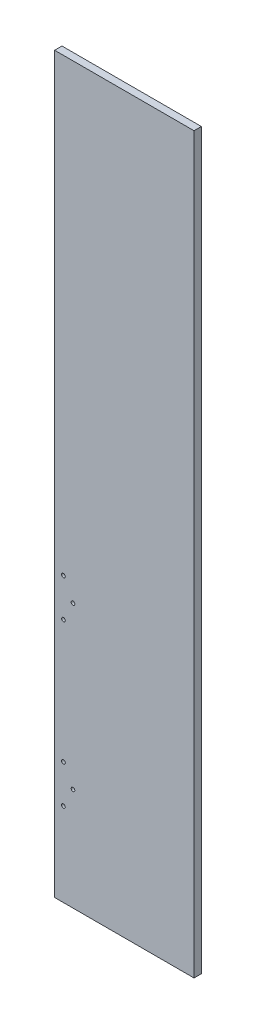
ISO-10303-21;
HEADER;
FILE_DESCRIPTION(('STEP AP214'),'2;1');
FILE_NAME('part.step','',(''),(''),'','','');
FILE_SCHEMA(('AUTOMOTIVE_DESIGN { 1 0 10303 214 1 1 1 1 }'));
ENDSEC;
DATA;
#1=APPLICATION_CONTEXT('core data for automotive mechanical design processes');
#2=APPLICATION_PROTOCOL_DEFINITION('international standard','automotive_design',2000,#1);
#3=PRODUCT_CONTEXT('',#1,'mechanical');
#4=PRODUCT('Part','Part','',(#3));
#5=PRODUCT_RELATED_PRODUCT_CATEGORY('part','',(#4));
#6=PRODUCT_DEFINITION_FORMATION('','',#4);
#7=PRODUCT_DEFINITION_CONTEXT('part definition',#1,'design');
#8=PRODUCT_DEFINITION('design','',#6,#7);
#9=PRODUCT_DEFINITION_SHAPE('','',#8);
#10=(LENGTH_UNIT() NAMED_UNIT(*) SI_UNIT(.MILLI.,.METRE.));
#11=(NAMED_UNIT(*) PLANE_ANGLE_UNIT() SI_UNIT($,.RADIAN.));
#12=(NAMED_UNIT(*) SI_UNIT($,.STERADIAN.) SOLID_ANGLE_UNIT());
#13=UNCERTAINTY_MEASURE_WITH_UNIT(LENGTH_MEASURE(1.E-05),#10,'distance_accuracy_value','');
#14=(GEOMETRIC_REPRESENTATION_CONTEXT(3) GLOBAL_UNCERTAINTY_ASSIGNED_CONTEXT((#13)) GLOBAL_UNIT_ASSIGNED_CONTEXT((#10,
#11,#12)) REPRESENTATION_CONTEXT('',''));
#15=CARTESIAN_POINT('',(0.,0.,0.));
#16=DIRECTION('',(0.,0.,1.));
#17=DIRECTION('',(1.,0.,0.));
#18=AXIS2_PLACEMENT_3D('',#15,#16,#17);
#19=CARTESIAN_POINT('',(-95.,-500.,10.));
#20=DIRECTION('',(1.,0.,0.));
#21=DIRECTION('',(0.,0.,-1.));
#22=AXIS2_PLACEMENT_3D('',#19,#20,#21);
#23=PLANE('',#22);
#24=DIRECTION('',(0.,-1.,0.));
#25=VECTOR('',#24,1.);
#26=CARTESIAN_POINT('',(-95.,-500.,0.));
#27=LINE('',#26,#25);
#28=CARTESIAN_POINT('',(-95.,500.,0.));
#29=VERTEX_POINT('',#28);
#30=CARTESIAN_POINT('',(-95.,-500.,0.));
#31=VERTEX_POINT('',#30);
#32=EDGE_CURVE('E96',#29,#31,#27,.T.);
#33=ORIENTED_EDGE('',*,*,#32,.T.);
#34=DIRECTION('',(0.,0.,-1.));
#35=VECTOR('',#34,1.);
#36=CARTESIAN_POINT('',(-95.,-500.,10.));
#37=LINE('',#36,#35);
#38=CARTESIAN_POINT('',(-95.,-500.,10.));
#39=VERTEX_POINT('',#38);
#40=EDGE_CURVE('E11',#39,#31,#37,.T.);
#41=ORIENTED_EDGE('',*,*,#40,.F.);
#42=DIRECTION('',(0.,-1.,0.));
#43=VECTOR('',#42,1.);
#44=CARTESIAN_POINT('',(-95.,-500.,10.));
#45=LINE('',#44,#43);
#46=CARTESIAN_POINT('',(-95.,500.,10.));
#47=VERTEX_POINT('',#46);
#48=EDGE_CURVE('E84',#47,#39,#45,.T.);
#49=ORIENTED_EDGE('',*,*,#48,.F.);
#50=DIRECTION('',(0.,0.,-1.));
#51=VECTOR('',#50,1.);
#52=CARTESIAN_POINT('',(-95.,500.,10.));
#53=LINE('',#52,#51);
#54=EDGE_CURVE('E92',#47,#29,#53,.T.);
#55=ORIENTED_EDGE('',*,*,#54,.T.);
#56=EDGE_LOOP('',(#33,#41,#49,#55));
#57=FACE_BOUND('',#56,.T.);
#58=ADVANCED_FACE('F33',(#57),#23,.F.);
#59=CARTESIAN_POINT('',(95.,-500.,10.));
#60=DIRECTION('',(0.,1.,0.));
#61=DIRECTION('',(0.,0.,1.));
#62=AXIS2_PLACEMENT_3D('',#59,#60,#61);
#63=PLANE('',#62);
#64=DIRECTION('',(1.,0.,0.));
#65=VECTOR('',#64,1.);
#66=CARTESIAN_POINT('',(95.,-500.,0.));
#67=LINE('',#66,#65);
#68=CARTESIAN_POINT('',(95.,-500.,0.));
#69=VERTEX_POINT('',#68);
#70=EDGE_CURVE('E88',#31,#69,#67,.T.);
#71=ORIENTED_EDGE('',*,*,#70,.T.);
#72=DIRECTION('',(0.,0.,-1.));
#73=VECTOR('',#72,1.);
#74=CARTESIAN_POINT('',(95.,-500.,10.));
#75=LINE('',#74,#73);
#76=CARTESIAN_POINT('',(95.,-500.,10.));
#77=VERTEX_POINT('',#76);
#78=EDGE_CURVE('E41',#77,#69,#75,.T.);
#79=ORIENTED_EDGE('',*,*,#78,.F.);
#80=DIRECTION('',(1.,0.,0.));
#81=VECTOR('',#80,1.);
#82=CARTESIAN_POINT('',(95.,-500.,10.));
#83=LINE('',#82,#81);
#84=EDGE_CURVE('E79',#39,#77,#83,.T.);
#85=ORIENTED_EDGE('',*,*,#84,.F.);
#86=ORIENTED_EDGE('',*,*,#40,.T.);
#87=EDGE_LOOP('',(#71,#79,#85,#86));
#88=FACE_BOUND('',#87,.T.);
#89=ADVANCED_FACE('F87',(#88),#63,.F.);
#90=CARTESIAN_POINT('',(95.,-500.,10.));
#91=DIRECTION('',(-1.,0.,0.));
#92=DIRECTION('',(0.,0.,1.));
#93=AXIS2_PLACEMENT_3D('',#90,#91,#92);
#94=PLANE('',#93);
#95=DIRECTION('',(0.,1.,0.));
#96=VECTOR('',#95,1.);
#97=CARTESIAN_POINT('',(95.,-500.,0.));
#98=LINE('',#97,#96);
#99=CARTESIAN_POINT('',(95.,500.,0.));
#100=VERTEX_POINT('',#99);
#101=EDGE_CURVE('E66',#69,#100,#98,.T.);
#102=ORIENTED_EDGE('',*,*,#101,.T.);
#103=DIRECTION('',(0.,0.,-1.));
#104=VECTOR('',#103,1.);
#105=CARTESIAN_POINT('',(95.,500.,10.));
#106=LINE('',#105,#104);
#107=CARTESIAN_POINT('',(95.,500.,10.));
#108=VERTEX_POINT('',#107);
#109=EDGE_CURVE('E89',#108,#100,#106,.T.);
#110=ORIENTED_EDGE('',*,*,#109,.F.);
#111=DIRECTION('',(0.,1.,0.));
#112=VECTOR('',#111,1.);
#113=CARTESIAN_POINT('',(95.,-500.,10.));
#114=LINE('',#113,#112);
#115=EDGE_CURVE('E82',#77,#108,#114,.T.);
#116=ORIENTED_EDGE('',*,*,#115,.F.);
#117=ORIENTED_EDGE('',*,*,#78,.T.);
#118=EDGE_LOOP('',(#102,#110,#116,#117));
#119=FACE_BOUND('',#118,.T.);
#120=ADVANCED_FACE('F90',(#119),#94,.F.);
#121=CARTESIAN_POINT('',(95.,500.,10.));
#122=DIRECTION('',(0.,-1.,0.));
#123=DIRECTION('',(0.,0.,-1.));
#124=AXIS2_PLACEMENT_3D('',#121,#122,#123);
#125=PLANE('',#124);
#126=DIRECTION('',(-1.,0.,0.));
#127=VECTOR('',#126,1.);
#128=CARTESIAN_POINT('',(95.,500.,0.));
#129=LINE('',#128,#127);
#130=EDGE_CURVE('E72',#100,#29,#129,.T.);
#131=ORIENTED_EDGE('',*,*,#130,.T.);
#132=ORIENTED_EDGE('',*,*,#54,.F.);
#133=DIRECTION('',(-1.,0.,0.));
#134=VECTOR('',#133,1.);
#135=CARTESIAN_POINT('',(95.,500.,10.));
#136=LINE('',#135,#134);
#137=EDGE_CURVE('E49',#108,#47,#136,.T.);
#138=ORIENTED_EDGE('',*,*,#137,.F.);
#139=ORIENTED_EDGE('',*,*,#109,.T.);
#140=EDGE_LOOP('',(#131,#132,#138,#139));
#141=FACE_BOUND('',#140,.T.);
#142=ADVANCED_FACE('F104',(#141),#125,.F.);
#143=CARTESIAN_POINT('',(0.,0.,10.));
#144=DIRECTION('',(0.,0.,1.));
#145=DIRECTION('',(1.,0.,0.));
#146=AXIS2_PLACEMENT_3D('',#143,#144,#145);
#147=PLANE('',#146);
#148=CARTESIAN_POINT('',(-70.,-360.,10.));
#149=DIRECTION('',(0.,0.,1.));
#150=DIRECTION('',(1.,0.,0.));
#151=AXIS2_PLACEMENT_3D('',#148,#149,#150);
#152=CIRCLE('',#151,2.5);
#153=CARTESIAN_POINT('',(-67.5,-360.,10.));
#154=VERTEX_POINT('',#153);
#155=EDGE_CURVE('E140',#154,#154,#152,.T.);
#156=ORIENTED_EDGE('',*,*,#155,.F.);
#157=EDGE_LOOP('',(#156));
#158=FACE_BOUND('',#157,.T.);
#159=CARTESIAN_POINT('',(-83.,-334.,10.));
#160=DIRECTION('',(0.,0.,1.));
#161=DIRECTION('',(1.,0.,0.));
#162=AXIS2_PLACEMENT_3D('',#159,#160,#161);
#163=CIRCLE('',#162,2.50000000000001);
#164=CARTESIAN_POINT('',(-80.5,-334.,10.));
#165=VERTEX_POINT('',#164);
#166=EDGE_CURVE('E134',#165,#165,#163,.T.);
#167=ORIENTED_EDGE('',*,*,#166,.F.);
#168=EDGE_LOOP('',(#167));
#169=FACE_BOUND('',#168,.T.);
#170=CARTESIAN_POINT('',(-83.,-166.,10.));
#171=DIRECTION('',(0.,0.,1.));
#172=DIRECTION('',(1.,0.,0.));
#173=AXIS2_PLACEMENT_3D('',#170,#171,#172);
#174=CIRCLE('',#173,2.50000000000001);
#175=CARTESIAN_POINT('',(-80.5,-166.,10.));
#176=VERTEX_POINT('',#175);
#177=EDGE_CURVE('E128',#176,#176,#174,.T.);
#178=ORIENTED_EDGE('',*,*,#177,.F.);
#179=EDGE_LOOP('',(#178));
#180=FACE_BOUND('',#179,.T.);
#181=CARTESIAN_POINT('',(-70.,-140.,10.));
#182=DIRECTION('',(0.,0.,1.));
#183=DIRECTION('',(1.,0.,0.));
#184=AXIS2_PLACEMENT_3D('',#181,#182,#183);
#185=CIRCLE('',#184,2.5);
#186=CARTESIAN_POINT('',(-67.5,-140.,10.));
#187=VERTEX_POINT('',#186);
#188=EDGE_CURVE('E122',#187,#187,#185,.T.);
#189=ORIENTED_EDGE('',*,*,#188,.F.);
#190=EDGE_LOOP('',(#189));
#191=FACE_BOUND('',#190,.T.);
#192=CARTESIAN_POINT('',(-83.,-114.,10.));
#193=DIRECTION('',(0.,0.,1.));
#194=DIRECTION('',(1.,0.,0.));
#195=AXIS2_PLACEMENT_3D('',#192,#193,#194);
#196=CIRCLE('',#195,2.50000000000001);
#197=CARTESIAN_POINT('',(-80.5,-114.,10.));
#198=VERTEX_POINT('',#197);
#199=EDGE_CURVE('E116',#198,#198,#196,.T.);
#200=ORIENTED_EDGE('',*,*,#199,.F.);
#201=EDGE_LOOP('',(#200));
#202=FACE_BOUND('',#201,.T.);
#203=CARTESIAN_POINT('',(-83.,-386.,10.));
#204=DIRECTION('',(0.,0.,1.));
#205=DIRECTION('',(1.,0.,0.));
#206=AXIS2_PLACEMENT_3D('',#203,#204,#205);
#207=CIRCLE('',#206,2.50000000000001);
#208=CARTESIAN_POINT('',(-80.5,-386.,10.));
#209=VERTEX_POINT('',#208);
#210=EDGE_CURVE('E110',#209,#209,#207,.T.);
#211=ORIENTED_EDGE('',*,*,#210,.F.);
#212=EDGE_LOOP('',(#211));
#213=FACE_BOUND('',#212,.T.);
#214=ORIENTED_EDGE('',*,*,#48,.T.);
#215=ORIENTED_EDGE('',*,*,#84,.T.);
#216=ORIENTED_EDGE('',*,*,#115,.T.);
#217=ORIENTED_EDGE('',*,*,#137,.T.);
#218=EDGE_LOOP('',(#214,#215,#216,#217));
#219=FACE_BOUND('',#218,.T.);
#220=ADVANCED_FACE('F80',(#158,#169,#180,#191,#202,#213,#219),#147,.T.);
#221=CARTESIAN_POINT('',(0.,0.,0.));
#222=DIRECTION('',(0.,0.,1.));
#223=DIRECTION('',(1.,0.,0.));
#224=AXIS2_PLACEMENT_3D('',#221,#222,#223);
#225=PLANE('',#224);
#226=CARTESIAN_POINT('',(-70.,-360.,0.));
#227=DIRECTION('',(0.,0.,1.));
#228=DIRECTION('',(1.,0.,0.));
#229=AXIS2_PLACEMENT_3D('',#226,#227,#228);
#230=CIRCLE('',#229,2.5);
#231=CARTESIAN_POINT('',(-67.5,-360.,0.));
#232=VERTEX_POINT('',#231);
#233=EDGE_CURVE('E113',#232,#232,#230,.T.);
#234=ORIENTED_EDGE('',*,*,#233,.T.);
#235=EDGE_LOOP('',(#234));
#236=FACE_BOUND('',#235,.T.);
#237=CARTESIAN_POINT('',(-83.,-334.,0.));
#238=DIRECTION('',(0.,0.,1.));
#239=DIRECTION('',(1.,0.,0.));
#240=AXIS2_PLACEMENT_3D('',#237,#238,#239);
#241=CIRCLE('',#240,2.50000000000001);
#242=CARTESIAN_POINT('',(-80.5,-334.,0.));
#243=VERTEX_POINT('',#242);
#244=EDGE_CURVE('E137',#243,#243,#241,.T.);
#245=ORIENTED_EDGE('',*,*,#244,.T.);
#246=EDGE_LOOP('',(#245));
#247=FACE_BOUND('',#246,.T.);
#248=CARTESIAN_POINT('',(-83.,-166.,0.));
#249=DIRECTION('',(0.,0.,1.));
#250=DIRECTION('',(1.,0.,0.));
#251=AXIS2_PLACEMENT_3D('',#248,#249,#250);
#252=CIRCLE('',#251,2.50000000000001);
#253=CARTESIAN_POINT('',(-80.5,-166.,0.));
#254=VERTEX_POINT('',#253);
#255=EDGE_CURVE('E131',#254,#254,#252,.T.);
#256=ORIENTED_EDGE('',*,*,#255,.T.);
#257=EDGE_LOOP('',(#256));
#258=FACE_BOUND('',#257,.T.);
#259=CARTESIAN_POINT('',(-70.,-140.,0.));
#260=DIRECTION('',(0.,0.,1.));
#261=DIRECTION('',(1.,0.,0.));
#262=AXIS2_PLACEMENT_3D('',#259,#260,#261);
#263=CIRCLE('',#262,2.5);
#264=CARTESIAN_POINT('',(-67.5,-140.,0.));
#265=VERTEX_POINT('',#264);
#266=EDGE_CURVE('E125',#265,#265,#263,.T.);
#267=ORIENTED_EDGE('',*,*,#266,.T.);
#268=EDGE_LOOP('',(#267));
#269=FACE_BOUND('',#268,.T.);
#270=CARTESIAN_POINT('',(-83.,-114.,0.));
#271=DIRECTION('',(0.,0.,1.));
#272=DIRECTION('',(1.,0.,0.));
#273=AXIS2_PLACEMENT_3D('',#270,#271,#272);
#274=CIRCLE('',#273,2.50000000000001);
#275=CARTESIAN_POINT('',(-80.5,-114.,0.));
#276=VERTEX_POINT('',#275);
#277=EDGE_CURVE('E119',#276,#276,#274,.T.);
#278=ORIENTED_EDGE('',*,*,#277,.T.);
#279=EDGE_LOOP('',(#278));
#280=FACE_BOUND('',#279,.T.);
#281=CARTESIAN_POINT('',(-83.,-386.,0.));
#282=DIRECTION('',(0.,0.,1.));
#283=DIRECTION('',(1.,0.,0.));
#284=AXIS2_PLACEMENT_3D('',#281,#282,#283);
#285=CIRCLE('',#284,2.50000000000001);
#286=CARTESIAN_POINT('',(-80.5,-386.,0.));
#287=VERTEX_POINT('',#286);
#288=EDGE_CURVE('E99',#287,#287,#285,.T.);
#289=ORIENTED_EDGE('',*,*,#288,.T.);
#290=EDGE_LOOP('',(#289));
#291=FACE_BOUND('',#290,.T.);
#292=ORIENTED_EDGE('',*,*,#32,.F.);
#293=ORIENTED_EDGE('',*,*,#130,.F.);
#294=ORIENTED_EDGE('',*,*,#101,.F.);
#295=ORIENTED_EDGE('',*,*,#70,.F.);
#296=EDGE_LOOP('',(#292,#293,#294,#295));
#297=FACE_BOUND('',#296,.T.);
#298=ADVANCED_FACE('F107',(#236,#247,#258,#269,#280,#291,#297),#225,.F.);
#299=CARTESIAN_POINT('',(-83.,-386.,0.));
#300=DIRECTION('',(0.,0.,1.));
#301=DIRECTION('',(1.,0.,0.));
#302=AXIS2_PLACEMENT_3D('',#299,#300,#301);
#303=CYLINDRICAL_SURFACE('',#302,2.50000000000001);
#304=ORIENTED_EDGE('',*,*,#288,.F.);
#305=EDGE_LOOP('',(#304));
#306=FACE_BOUND('',#305,.T.);
#307=ORIENTED_EDGE('',*,*,#210,.T.);
#308=EDGE_LOOP('',(#307));
#309=FACE_BOUND('',#308,.T.);
#310=ADVANCED_FACE('F168',(#306,#309),#303,.F.);
#311=CARTESIAN_POINT('',(-83.,-114.,0.));
#312=DIRECTION('',(0.,0.,1.));
#313=DIRECTION('',(1.,0.,0.));
#314=AXIS2_PLACEMENT_3D('',#311,#312,#313);
#315=CYLINDRICAL_SURFACE('',#314,2.50000000000001);
#316=ORIENTED_EDGE('',*,*,#277,.F.);
#317=EDGE_LOOP('',(#316));
#318=FACE_BOUND('',#317,.T.);
#319=ORIENTED_EDGE('',*,*,#199,.T.);
#320=EDGE_LOOP('',(#319));
#321=FACE_BOUND('',#320,.T.);
#322=ADVANCED_FACE('F170',(#318,#321),#315,.F.);
#323=CARTESIAN_POINT('',(-70.,-140.,0.));
#324=DIRECTION('',(0.,0.,1.));
#325=DIRECTION('',(1.,0.,0.));
#326=AXIS2_PLACEMENT_3D('',#323,#324,#325);
#327=CYLINDRICAL_SURFACE('',#326,2.5);
#328=ORIENTED_EDGE('',*,*,#266,.F.);
#329=EDGE_LOOP('',(#328));
#330=FACE_BOUND('',#329,.T.);
#331=ORIENTED_EDGE('',*,*,#188,.T.);
#332=EDGE_LOOP('',(#331));
#333=FACE_BOUND('',#332,.T.);
#334=ADVANCED_FACE('F177',(#330,#333),#327,.F.);
#335=CARTESIAN_POINT('',(-83.,-166.,0.));
#336=DIRECTION('',(0.,0.,1.));
#337=DIRECTION('',(1.,0.,0.));
#338=AXIS2_PLACEMENT_3D('',#335,#336,#337);
#339=CYLINDRICAL_SURFACE('',#338,2.50000000000001);
#340=ORIENTED_EDGE('',*,*,#255,.F.);
#341=EDGE_LOOP('',(#340));
#342=FACE_BOUND('',#341,.T.);
#343=ORIENTED_EDGE('',*,*,#177,.T.);
#344=EDGE_LOOP('',(#343));
#345=FACE_BOUND('',#344,.T.);
#346=ADVANCED_FACE('F223',(#342,#345),#339,.F.);
#347=CARTESIAN_POINT('',(-83.,-334.,0.));
#348=DIRECTION('',(0.,0.,1.));
#349=DIRECTION('',(1.,0.,0.));
#350=AXIS2_PLACEMENT_3D('',#347,#348,#349);
#351=CYLINDRICAL_SURFACE('',#350,2.50000000000001);
#352=ORIENTED_EDGE('',*,*,#244,.F.);
#353=EDGE_LOOP('',(#352));
#354=FACE_BOUND('',#353,.T.);
#355=ORIENTED_EDGE('',*,*,#166,.T.);
#356=EDGE_LOOP('',(#355));
#357=FACE_BOUND('',#356,.T.);
#358=ADVANCED_FACE('F151',(#354,#357),#351,.F.);
#359=CARTESIAN_POINT('',(-70.,-360.,0.));
#360=DIRECTION('',(0.,0.,1.));
#361=DIRECTION('',(1.,0.,0.));
#362=AXIS2_PLACEMENT_3D('',#359,#360,#361);
#363=CYLINDRICAL_SURFACE('',#362,2.5);
#364=ORIENTED_EDGE('',*,*,#233,.F.);
#365=EDGE_LOOP('',(#364));
#366=FACE_BOUND('',#365,.T.);
#367=ORIENTED_EDGE('',*,*,#155,.T.);
#368=EDGE_LOOP('',(#367));
#369=FACE_BOUND('',#368,.T.);
#370=ADVANCED_FACE('F148',(#366,#369),#363,.F.);
#371=CLOSED_SHELL('',(#58,#89,#120,#142,#220,#298,#310,#322,#334,#346,#358,#370));
#372=MANIFOLD_SOLID_BREP('B2',#371);
#373=ADVANCED_BREP_SHAPE_REPRESENTATION('',(#18,#372),#14);
#374=SHAPE_DEFINITION_REPRESENTATION(#9,#373);
ENDSEC;
END-ISO-10303-21;
